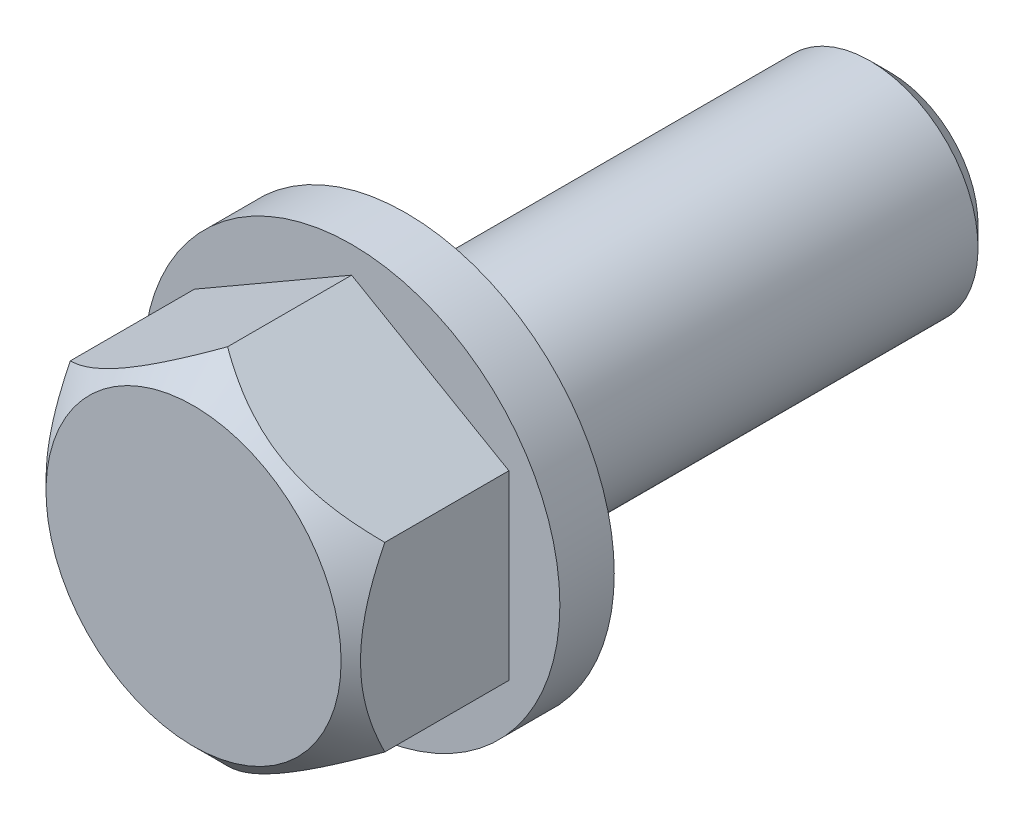
ISO-10303-21;
HEADER;
FILE_DESCRIPTION(('STEP AP214'),'2;1');
FILE_NAME('part.step','',(''),(''),'','','');
FILE_SCHEMA(('AUTOMOTIVE_DESIGN { 1 0 10303 214 1 1 1 1 }'));
ENDSEC;
DATA;
#1=APPLICATION_CONTEXT('core data for automotive mechanical design processes');
#2=APPLICATION_PROTOCOL_DEFINITION('international standard','automotive_design',2000,#1);
#3=PRODUCT_CONTEXT('',#1,'mechanical');
#4=PRODUCT('Part','Part','',(#3));
#5=PRODUCT_RELATED_PRODUCT_CATEGORY('part','',(#4));
#6=PRODUCT_DEFINITION_FORMATION('','',#4);
#7=PRODUCT_DEFINITION_CONTEXT('part definition',#1,'design');
#8=PRODUCT_DEFINITION('design','',#6,#7);
#9=PRODUCT_DEFINITION_SHAPE('','',#8);
#10=(LENGTH_UNIT() NAMED_UNIT(*) SI_UNIT(.MILLI.,.METRE.));
#11=(NAMED_UNIT(*) PLANE_ANGLE_UNIT() SI_UNIT($,.RADIAN.));
#12=(NAMED_UNIT(*) SI_UNIT($,.STERADIAN.) SOLID_ANGLE_UNIT());
#13=UNCERTAINTY_MEASURE_WITH_UNIT(LENGTH_MEASURE(1.E-05),#10,'distance_accuracy_value','');
#14=(GEOMETRIC_REPRESENTATION_CONTEXT(3) GLOBAL_UNCERTAINTY_ASSIGNED_CONTEXT((#13)) GLOBAL_UNIT_ASSIGNED_CONTEXT((#10,
#11,#12)) REPRESENTATION_CONTEXT('',''));
#15=CARTESIAN_POINT('',(0.,0.,0.));
#16=DIRECTION('',(0.,0.,1.));
#17=DIRECTION('',(1.,0.,0.));
#18=AXIS2_PLACEMENT_3D('',#15,#16,#17);
#19=CARTESIAN_POINT('',(0.,-10.6809799800081,-9.3));
#20=DIRECTION('',(0.5,-0.866025403784439,0.));
#21=DIRECTION('',(0.866025403784439,0.5,0.));
#22=AXIS2_PLACEMENT_3D('',#19,#20,#21);
#23=PLANE('',#22);
#24=DIRECTION('',(0.,0.,1.));
#25=VECTOR('',#24,1.);
#26=CARTESIAN_POINT('',(9.25,-5.34048999000404,-9.3));
#27=LINE('',#26,#25);
#28=CARTESIAN_POINT('',(9.25,-5.34048999000404,-9.3));
#29=VERTEX_POINT('',#28);
#30=CARTESIAN_POINT('',(9.25,-5.34048999000404,-2.));
#31=VERTEX_POINT('',#30);
#32=EDGE_CURVE('E125',#29,#31,#27,.T.);
#33=ORIENTED_EDGE('',*,*,#32,.T.);
#34=CARTESIAN_POINT('',(9.2502,-5.3403745199502,-2.00011547192631));
#35=CARTESIAN_POINT('',(9.09117082529351,-5.432190056776,-1.90831281123347));
#36=CARTESIAN_POINT('',(8.93089619346711,-5.52472465860524,-1.81931145467502));
#37=CARTESIAN_POINT('',(8.6076621476001,-5.71134392199781,-1.64780119366554));
#38=CARTESIAN_POINT('',(8.44470132522216,-5.80542939666508,-1.56529583497294));
#39=CARTESIAN_POINT('',(8.1151323907501,-5.99570610969906,-1.40731799648944));
#40=CARTESIAN_POINT('',(7.94850873763559,-6.09190632067808,-1.33188849049753));
#41=CARTESIAN_POINT('',(7.61252468736863,-6.28588680254313,-1.18970062540129));
#42=CARTESIAN_POINT('',(7.44316471309404,-6.38366682928051,-1.12294094058453));
#43=CARTESIAN_POINT('',(7.10443107680896,-6.57923478537328,-1.00020501694454));
#44=CARTESIAN_POINT('',(6.93509904174261,-6.67699868140127,-0.944076478347854));
#45=CARTESIAN_POINT('',(6.59406122655675,-6.87389695580267,-0.842460895203026));
#46=CARTESIAN_POINT('',(6.42235570410425,-6.97303118541196,-0.79697270499414));
#47=CARTESIAN_POINT('',(6.07730535270669,-7.17224609867532,-0.71778303641852));
#48=CARTESIAN_POINT('',(5.90396513173763,-7.27232412191319,-0.684055027186603));
#49=CARTESIAN_POINT('',(5.55582943891564,-7.47332035787849,-0.629126852516565));
#50=CARTESIAN_POINT('',(5.3810341884856,-7.57423844276734,-0.607924815013476));
#51=CARTESIAN_POINT('',(4.95507380895619,-7.82016678255276,-0.572375032527324));
#52=CARTESIAN_POINT('',(4.70344827751648,-7.96544285086446,-0.564914882215165));
#53=CARTESIAN_POINT('',(4.20065228771178,-8.25573225092567,-0.577436236604018));
#54=CARTESIAN_POINT('',(3.94948201975904,-8.40074547274061,-0.597427360386295));
#55=CARTESIAN_POINT('',(3.44950913561555,-8.68940495198837,-0.663671275135095));
#56=CARTESIAN_POINT('',(3.20070948383191,-8.83304949791994,-0.70995343234196));
#57=CARTESIAN_POINT('',(2.7073865670808,-9.1178696167036,-0.8262636629672));
#58=CARTESIAN_POINT('',(2.46286297569687,-9.25904537801233,-0.896289915467007));
#59=CARTESIAN_POINT('',(2.02879977798028,-9.50965188205931,-1.04035187084842));
#60=CARTESIAN_POINT('',(1.83829883414503,-9.61963765326347,-1.11059807056833));
#61=CARTESIAN_POINT('',(1.46071648912269,-9.83763492180337,-1.26240987315371));
#62=CARTESIAN_POINT('',(1.27363519162817,-9.94564635927218,-1.34397581862107));
#63=CARTESIAN_POINT('',(0.903481391738886,-10.1593547552798,-1.5165988394071));
#64=CARTESIAN_POINT('',(0.720398362181627,-10.2650577916788,-1.60762606622998));
#65=CARTESIAN_POINT('',(0.35762230569886,-10.4745066455446,-1.79797669578419));
#66=CARTESIAN_POINT('',(0.177927281929603,-10.5782536158898,-1.89729501176252));
#67=CARTESIAN_POINT('',(-0.000199999999996942,-10.6810954500619,-2.00011547192631));
#68=B_SPLINE_CURVE_WITH_KNOTS('',3,(#34,#35,#36,#37,#38,#39,#40,#41,#42,#43,#44,#45,#46,#47,#48,
#49,#50,#51,#52,#53,#54,#55,#56,#57,#58,#59,#60,#61,#62,#63,#64,#65,#66,#67),.UNSPECIFIED.,.F.,
.F.,(4,2,2,2,2,2,2,2,2,2,2,2,2,2,2,2,4),(0.,0.615926148952827,1.23218619568639,1.85197482577676,
2.47166857139587,3.08167196465217,3.69160964775171,4.3001622758662,4.90862392992529,
5.77920863985932,6.65009848544269,7.52196300514644,8.39376067726822,9.08618244548536,
9.77862517501767,10.468946126611,11.1588466217033),.UNSPECIFIED.);
#69=CARTESIAN_POINT('',(0.,-10.6809799800081,-2.));
#70=VERTEX_POINT('',#69);
#71=EDGE_CURVE('E64',#31,#70,#68,.T.);
#72=ORIENTED_EDGE('',*,*,#71,.T.);
#73=DIRECTION('',(0.,0.,1.));
#74=VECTOR('',#73,1.);
#75=CARTESIAN_POINT('',(0.,-10.6809799800081,-9.3));
#76=LINE('',#75,#74);
#77=CARTESIAN_POINT('',(0.,-10.6809799800081,-9.3));
#78=VERTEX_POINT('',#77);
#79=EDGE_CURVE('E136',#78,#70,#76,.T.);
#80=ORIENTED_EDGE('',*,*,#79,.F.);
#81=DIRECTION('',(0.866025403784439,0.5,0.));
#82=VECTOR('',#81,1.);
#83=CARTESIAN_POINT('',(0.,-10.6809799800081,-9.3));
#84=LINE('',#83,#82);
#85=EDGE_CURVE('E241',#78,#29,#84,.T.);
#86=ORIENTED_EDGE('',*,*,#85,.T.);
#87=EDGE_LOOP('',(#33,#72,#80,#86));
#88=FACE_BOUND('',#87,.T.);
#89=ADVANCED_FACE('F47',(#88),#23,.T.);
#90=CARTESIAN_POINT('',(-9.25,-5.34048999000404,-9.3));
#91=DIRECTION('',(-0.5,-0.866025403784439,0.));
#92=DIRECTION('',(0.866025403784439,-0.5,0.));
#93=AXIS2_PLACEMENT_3D('',#90,#91,#92);
#94=PLANE('',#93);
#95=ORIENTED_EDGE('',*,*,#79,.T.);
#96=CARTESIAN_POINT('',(0.000200000000002945,-10.6810954500619,-2.0001154719263));
#97=CARTESIAN_POINT('',(-0.158829174706487,-10.5892799132361,-1.90831281123347));
#98=CARTESIAN_POINT('',(-0.319103806532885,-10.4967453114069,-1.81931145467501));
#99=CARTESIAN_POINT('',(-0.642337852399898,-10.3101260480143,-1.64780119366554));
#100=CARTESIAN_POINT('',(-0.805298674777844,-10.216040573347,-1.56529583497294));
#101=CARTESIAN_POINT('',(-1.1348676092499,-10.0257638603131,-1.40731799648944));
#102=CARTESIAN_POINT('',(-1.30149126236441,-9.92956364933404,-1.33188849049752));
#103=CARTESIAN_POINT('',(-1.63747531263137,-9.73558316746899,-1.18970062540129));
#104=CARTESIAN_POINT('',(-1.80683528690596,-9.6378031407316,-1.12294094058453));
#105=CARTESIAN_POINT('',(-2.14556892319104,-9.44223518463883,-1.00020501694454));
#106=CARTESIAN_POINT('',(-2.31490095825739,-9.34447128861085,-0.944076478347851));
#107=CARTESIAN_POINT('',(-2.65593877344325,-9.14757301420945,-0.842460895203023));
#108=CARTESIAN_POINT('',(-2.82764429589575,-9.04843878460015,-0.796972704994138));
#109=CARTESIAN_POINT('',(-3.17269464729331,-8.8492238713368,-0.717783036418518));
#110=CARTESIAN_POINT('',(-3.34603486826237,-8.74914584809892,-0.684055027186601));
#111=CARTESIAN_POINT('',(-3.69417056108436,-8.54814961213363,-0.629126852516562));
#112=CARTESIAN_POINT('',(-3.8689658115144,-8.44723152724477,-0.607924815013472));
#113=CARTESIAN_POINT('',(-4.29492619104381,-8.20130318745936,-0.57237503252732));
#114=CARTESIAN_POINT('',(-4.54655172248352,-8.05602711914766,-0.564914882215162));
#115=CARTESIAN_POINT('',(-5.04934771228823,-7.76573771908645,-0.577436236604014));
#116=CARTESIAN_POINT('',(-5.30051798024096,-7.62072449727151,-0.59742736038629));
#117=CARTESIAN_POINT('',(-5.80049086438445,-7.33206501802375,-0.66367127513509));
#118=CARTESIAN_POINT('',(-6.04929051616809,-7.18842047209218,-0.709953432341956));
#119=CARTESIAN_POINT('',(-6.5426134329192,-6.90360035330851,-0.826263662967196));
#120=CARTESIAN_POINT('',(-6.78713702430313,-6.76242459199979,-0.896289915467003));
#121=CARTESIAN_POINT('',(-7.22120022201972,-6.5118180879528,-1.04035187084842));
#122=CARTESIAN_POINT('',(-7.41170116585497,-6.40183231674864,-1.11059807056833));
#123=CARTESIAN_POINT('',(-7.78928351087731,-6.18383504820874,-1.26240987315371));
#124=CARTESIAN_POINT('',(-7.97636480837183,-6.07582361073994,-1.34397581862107));
#125=CARTESIAN_POINT('',(-8.34651860826111,-5.8621152147323,-1.51659883940709));
#126=CARTESIAN_POINT('',(-8.52960163781837,-5.75641217833336,-1.60762606622997));
#127=CARTESIAN_POINT('',(-8.89237769430114,-5.54696332446749,-1.79797669578418));
#128=CARTESIAN_POINT('',(-9.0720727180704,-5.44321635412227,-1.89729501176251));
#129=CARTESIAN_POINT('',(-9.2502,-5.3403745199502,-2.0001154719263));
#130=B_SPLINE_CURVE_WITH_KNOTS('',3,(#96,#97,#98,#99,#100,#101,#102,#103,#104,#105,#106,#107,
#108,#109,#110,#111,#112,#113,#114,#115,#116,#117,#118,#119,#120,#121,#122,#123,#124,#125,#126,
#127,#128,#129),.UNSPECIFIED.,.F.,.F.,(4,2,2,2,2,2,2,2,2,2,2,2,2,2,2,2,4),(0.,0.615926148952828,
1.23218619568639,1.85197482577676,2.47166857139587,3.08167196465217,3.69160964775171,
4.3001622758662,4.90862392992529,5.77920863985932,6.6500984854427,7.52196300514645,
8.39376067726822,9.08618244548536,9.77862517501767,10.468946126611,11.1588466217033),.UNSPECIFIED.);
#131=CARTESIAN_POINT('',(-9.25,-5.34048999000405,-2.));
#132=VERTEX_POINT('',#131);
#133=EDGE_CURVE('E167',#70,#132,#130,.T.);
#134=ORIENTED_EDGE('',*,*,#133,.T.);
#135=DIRECTION('',(0.,0.,1.));
#136=VECTOR('',#135,1.);
#137=CARTESIAN_POINT('',(-9.25,-5.34048999000404,-9.3));
#138=LINE('',#137,#136);
#139=CARTESIAN_POINT('',(-9.25,-5.34048999000404,-9.3));
#140=VERTEX_POINT('',#139);
#141=EDGE_CURVE('E141',#140,#132,#138,.T.);
#142=ORIENTED_EDGE('',*,*,#141,.F.);
#143=DIRECTION('',(0.866025403784439,-0.5,0.));
#144=VECTOR('',#143,1.);
#145=CARTESIAN_POINT('',(-9.25,-5.34048999000404,-9.3));
#146=LINE('',#145,#144);
#147=EDGE_CURVE('E131',#140,#78,#146,.T.);
#148=ORIENTED_EDGE('',*,*,#147,.T.);
#149=EDGE_LOOP('',(#95,#134,#142,#148));
#150=FACE_BOUND('',#149,.T.);
#151=ADVANCED_FACE('F221',(#150),#94,.T.);
#152=CARTESIAN_POINT('',(-9.25,5.34048999000404,-9.3));
#153=DIRECTION('',(-1.,0.,0.));
#154=DIRECTION('',(0.,-1.,0.));
#155=AXIS2_PLACEMENT_3D('',#152,#153,#154);
#156=PLANE('',#155);
#157=ORIENTED_EDGE('',*,*,#141,.T.);
#158=CARTESIAN_POINT('',(-9.25,-16.2073055318061,-9.98018966718476));
#159=CARTESIAN_POINT('',(-9.25,-15.9678781635089,-9.7722539072238));
#160=CARTESIAN_POINT('',(-9.25,-15.7278971183755,-9.56495385584864));
#161=CARTESIAN_POINT('',(-9.25,-15.2466782313579,-9.1518100819196));
#162=CARTESIAN_POINT('',(-9.25,-15.0054403690818,-8.94596638312357));
#163=CARTESIAN_POINT('',(-9.25,-14.5214529988361,-8.53583108855453));
#164=CARTESIAN_POINT('',(-9.25,-14.2787028364467,-8.33154026398782));
#165=CARTESIAN_POINT('',(-9.25,-13.7916274961275,-7.92484960134089));
#166=CARTESIAN_POINT('',(-9.25,-13.5473023236523,-7.72244975671777));
#167=CARTESIAN_POINT('',(-9.25,-12.8005838203051,-7.10936720830747));
#168=CARTESIAN_POINT('',(-9.25,-12.2953670858196,-6.70209594750844));
#169=CARTESIAN_POINT('',(-9.25,-11.5304149451627,-6.10037219288189));
#170=CARTESIAN_POINT('',(-9.25,-11.2742709885391,-5.90134904113106));
#171=CARTESIAN_POINT('',(-9.25,-10.7592285502089,-5.50690305795693));
#172=CARTESIAN_POINT('',(-9.25,-10.5003301254475,-5.31148015233051));
#173=CARTESIAN_POINT('',(-9.25,-9.97902261866834,-4.92463751590594));
#174=CARTESIAN_POINT('',(-9.25,-9.71660934357748,-4.7332234259717));
#175=CARTESIAN_POINT('',(-9.25,-9.1881196213626,-4.35550237519892));
#176=CARTESIAN_POINT('',(-9.25,-8.9220431333944,-4.16919547137397));
#177=CARTESIAN_POINT('',(-9.25,-8.38543327589617,-3.80259161665303));
#178=CARTESIAN_POINT('',(-9.25,-8.11489626573726,-3.62229997923442));
#179=CARTESIAN_POINT('',(-9.25,-7.56894083367665,-3.26925003684118));
#180=CARTESIAN_POINT('',(-9.25,-7.2935225180259,-3.09649156817527));
#181=CARTESIAN_POINT('',(-9.25,-6.73913234468851,-2.76148387056414));
#182=CARTESIAN_POINT('',(-9.25,-6.46020211403959,-2.59916607453986));
#183=CARTESIAN_POINT('',(-9.25,-5.89599970411699,-2.28580012084528));
#184=CARTESIAN_POINT('',(-9.25,-5.61072676547328,-2.13475332210918));
#185=CARTESIAN_POINT('',(-9.25,-5.03354697801002,-1.84691722860305));
#186=CARTESIAN_POINT('',(-9.25,-4.74165053762485,-1.71010722751813));
#187=CARTESIAN_POINT('',(-9.25,-4.15035077340609,-1.4539574466951));
#188=CARTESIAN_POINT('',(-9.25,-3.85095040744964,-1.33461090627094));
#189=CARTESIAN_POINT('',(-9.25,-3.2374254237705,-1.11491653345315));
#190=CARTESIAN_POINT('',(-9.25,-2.92312070330237,-1.01506460459859));
#191=CARTESIAN_POINT('',(-9.25,-2.28704102416632,-0.842647263308085));
#192=CARTESIAN_POINT('',(-9.25,-1.96526726488773,-0.770077501607849));
#193=CARTESIAN_POINT('',(-9.25,-1.31811878474162,-0.657071568600081));
#194=CARTESIAN_POINT('',(-9.25,-0.992779870504323,-0.616434414063451));
#195=CARTESIAN_POINT('',(-9.25,-0.339614584822021,-0.569523971691054));
#196=CARTESIAN_POINT('',(-9.25,-0.011788499089432,-0.563246794878713));
#197=CARTESIAN_POINT('',(-9.25,0.64319116384938,-0.585564944505225));
#198=CARTESIAN_POINT('',(-9.25,0.970342728516819,-0.614218034153677));
#199=CARTESIAN_POINT('',(-9.25,1.62006883717422,-0.70429930220099));
#200=CARTESIAN_POINT('',(-9.25,1.94264244954198,-0.765734056267042));
#201=CARTESIAN_POINT('',(-9.25,2.58315376881698,-0.917852038451622));
#202=CARTESIAN_POINT('',(-9.25,2.90104121716928,-1.00874315281992));
#203=CARTESIAN_POINT('',(-9.25,3.52872539094528,-1.21479914256161));
#204=CARTESIAN_POINT('',(-9.25,3.8385219800585,-1.32996442659717));
#205=CARTESIAN_POINT('',(-9.25,4.51609593501325,-1.60699074321429));
#206=CARTESIAN_POINT('',(-9.25,4.88192980176048,-1.77356435982661));
#207=CARTESIAN_POINT('',(-9.25,5.60272397140078,-2.12895227072771));
#208=CARTESIAN_POINT('',(-9.25,5.9576778820508,-2.31777933540331));
#209=CARTESIAN_POINT('',(-9.25,6.65870649250262,-2.71274056848074));
#210=CARTESIAN_POINT('',(-9.25,7.00476140403261,-2.91890957352869));
#211=CARTESIAN_POINT('',(-9.25,7.68863864749028,-3.34424432957733));
#212=CARTESIAN_POINT('',(-9.25,8.02646258620043,-3.56340751481147));
#213=CARTESIAN_POINT('',(-9.25,8.69706988954527,-4.01308751010601));
#214=CARTESIAN_POINT('',(-9.25,9.02981641353876,-4.24365900128318));
#215=CARTESIAN_POINT('',(-9.25,9.68954518769361,-4.71290111026426));
#216=CARTESIAN_POINT('',(-9.25,10.0165272305575,-4.95157201843363));
#217=CARTESIAN_POINT('',(-9.25,10.6652807103912,-5.43511086247931));
#218=CARTESIAN_POINT('',(-9.25,10.9870576877872,-5.67997138537518));
#219=CARTESIAN_POINT('',(-9.25,11.626542664597,-6.17492887086111));
#220=CARTESIAN_POINT('',(-9.25,11.9442507209077,-6.42502576010033));
#221=CARTESIAN_POINT('',(-9.25,12.5973397567391,-6.94637564824397));
#222=CARTESIAN_POINT('',(-9.25,12.9324832396665,-7.21792570565272));
#223=CARTESIAN_POINT('',(-9.25,13.5994689753692,-7.76504420502935));
#224=CARTESIAN_POINT('',(-9.25,13.9313112275982,-8.04061264766225));
#225=CARTESIAN_POINT('',(-9.25,14.5885335099744,-8.59200844918036));
#226=CARTESIAN_POINT('',(-9.25,14.9139443985055,-8.86779908050375));
#227=CARTESIAN_POINT('',(-9.25,15.5623349577207,-9.42207966751684));
#228=CARTESIAN_POINT('',(-9.25,15.8853151531877,-9.70056900901929));
#229=CARTESIAN_POINT('',(-9.25,16.2073055318061,-9.98018966718477));
#230=B_SPLINE_CURVE_WITH_KNOTS('',3,(#158,#159,#160,#161,#162,#163,#164,#165,#166,#167,#168,
#169,#170,#171,#172,#173,#174,#175,#176,#177,#178,#179,#180,#181,#182,#183,#184,#185,#186,#187,
#188,#189,#190,#191,#192,#193,#194,#195,#196,#197,#198,#199,#200,#201,#202,#203,#204,#205,#206,
#207,#208,#209,#210,#211,#212,#213,#214,#215,#216,#217,#218,#219,#220,#221,#222,#223,#224,#225,
#226,#227,#228,#229),.UNSPECIFIED.,.F.,.F.,(4,2,2,2,2,2,2,2,2,2,2,2,2,2,2,2,2,2,2,2,2,2,2,2,2,2,
2,2,2,2,2,2,2,2,2,4),(0.,0.951349366823518,1.90271421763447,2.85452416399449,3.80633081581425,
5.75295862793108,6.72606325135628,7.69914779604991,8.67352029327958,9.64790366340001,
10.6231260999126,11.5983273348509,12.5662803021357,13.5343497867131,14.5009910101004,
15.4672570188103,16.4555812424731,17.4437478427394,18.4256439818353,19.4074289843617,
20.3908397421021,21.3744478361953,22.3651546246029,23.3558780931577,24.5607737342995,
25.7663642162179,26.9744371437454,28.1822723204906,29.396597885687,30.6109670307448,
31.8239449163693,33.0369058219907,34.3309100547464,35.6249145016516,36.9045756428919,
38.1839520893548),.UNSPECIFIED.);
#231=CARTESIAN_POINT('',(-9.25,5.34048999000404,-2.));
#232=VERTEX_POINT('',#231);
#233=EDGE_CURVE('E164',#132,#232,#230,.T.);
#234=ORIENTED_EDGE('',*,*,#233,.T.);
#235=DIRECTION('',(0.,0.,1.));
#236=VECTOR('',#235,1.);
#237=CARTESIAN_POINT('',(-9.25,5.34048999000404,-9.3));
#238=LINE('',#237,#236);
#239=CARTESIAN_POINT('',(-9.25,5.34048999000404,-9.3));
#240=VERTEX_POINT('',#239);
#241=EDGE_CURVE('E129',#240,#232,#238,.T.);
#242=ORIENTED_EDGE('',*,*,#241,.F.);
#243=DIRECTION('',(0.,-1.,0.));
#244=VECTOR('',#243,1.);
#245=CARTESIAN_POINT('',(-9.25,5.34048999000404,-9.3));
#246=LINE('',#245,#244);
#247=EDGE_CURVE('E163',#240,#140,#246,.T.);
#248=ORIENTED_EDGE('',*,*,#247,.T.);
#249=EDGE_LOOP('',(#157,#234,#242,#248));
#250=FACE_BOUND('',#249,.T.);
#251=ADVANCED_FACE('F162',(#250),#156,.T.);
#252=CARTESIAN_POINT('',(0.,10.6809799800081,-9.3));
#253=DIRECTION('',(-0.5,0.866025403784439,0.));
#254=DIRECTION('',(-0.866025403784439,-0.5,0.));
#255=AXIS2_PLACEMENT_3D('',#252,#253,#254);
#256=PLANE('',#255);
#257=ORIENTED_EDGE('',*,*,#241,.T.);
#258=CARTESIAN_POINT('',(-9.2502,5.3403745199502,-2.0001154719263));
#259=CARTESIAN_POINT('',(-9.09117082529351,5.432190056776,-1.90831281123347));
#260=CARTESIAN_POINT('',(-8.93089619346711,5.52472465860524,-1.81931145467501));
#261=CARTESIAN_POINT('',(-8.6076621476001,5.71134392199781,-1.64780119366554));
#262=CARTESIAN_POINT('',(-8.44470132522215,5.80542939666508,-1.56529583497294));
#263=CARTESIAN_POINT('',(-8.1151323907501,5.99570610969906,-1.40731799648944));
#264=CARTESIAN_POINT('',(-7.94850873763559,6.09190632067808,-1.33188849049752));
#265=CARTESIAN_POINT('',(-7.61252468736863,6.28588680254313,-1.18970062540129));
#266=CARTESIAN_POINT('',(-7.44316471309404,6.38366682928051,-1.12294094058453));
#267=CARTESIAN_POINT('',(-7.10443107680896,6.57923478537328,-1.00020501694454));
#268=CARTESIAN_POINT('',(-6.93509904174261,6.67699868140127,-0.944076478347853));
#269=CARTESIAN_POINT('',(-6.59406122655675,6.87389695580267,-0.842460895203025));
#270=CARTESIAN_POINT('',(-6.42235570410424,6.97303118541196,-0.79697270499414));
#271=CARTESIAN_POINT('',(-6.07730535270669,7.17224609867532,-0.717783036418521));
#272=CARTESIAN_POINT('',(-5.90396513173763,7.27232412191319,-0.684055027186604));
#273=CARTESIAN_POINT('',(-5.55582943891564,7.47332035787849,-0.629126852516564));
#274=CARTESIAN_POINT('',(-5.3810341884856,7.57423844276734,-0.607924815013474));
#275=CARTESIAN_POINT('',(-4.95507380895619,7.82016678255276,-0.572375032527322));
#276=CARTESIAN_POINT('',(-4.70344827751647,7.96544285086446,-0.564914882215164));
#277=CARTESIAN_POINT('',(-4.20065228771177,8.25573225092567,-0.577436236604017));
#278=CARTESIAN_POINT('',(-3.94948201975904,8.40074547274061,-0.597427360386293));
#279=CARTESIAN_POINT('',(-3.44950913561555,8.68940495198837,-0.663671275135094));
#280=CARTESIAN_POINT('',(-3.20070948383191,8.83304949791994,-0.70995343234196));
#281=CARTESIAN_POINT('',(-2.7073865670808,9.1178696167036,-0.8262636629672));
#282=CARTESIAN_POINT('',(-2.46286297569687,9.25904537801233,-0.896289915467007));
#283=CARTESIAN_POINT('',(-2.02879977798028,9.50965188205931,-1.04035187084842));
#284=CARTESIAN_POINT('',(-1.83829883414503,9.61963765326347,-1.11059807056833));
#285=CARTESIAN_POINT('',(-1.46071648912268,9.83763492180337,-1.26240987315371));
#286=CARTESIAN_POINT('',(-1.27363519162816,9.94564635927218,-1.34397581862107));
#287=CARTESIAN_POINT('',(-0.903481391738882,10.1593547552798,-1.5165988394071));
#288=CARTESIAN_POINT('',(-0.720398362181622,10.2650577916788,-1.60762606622998));
#289=CARTESIAN_POINT('',(-0.357622305698855,10.4745066455446,-1.79797669578419));
#290=CARTESIAN_POINT('',(-0.177927281929599,10.5782536158898,-1.89729501176252));
#291=CARTESIAN_POINT('',(0.000200000000001436,10.6810954500619,-2.00011547192631));
#292=B_SPLINE_CURVE_WITH_KNOTS('',3,(#258,#259,#260,#261,#262,#263,#264,#265,#266,#267,#268,
#269,#270,#271,#272,#273,#274,#275,#276,#277,#278,#279,#280,#281,#282,#283,#284,#285,#286,#287,
#288,#289,#290,#291),.UNSPECIFIED.,.F.,.F.,(4,2,2,2,2,2,2,2,2,2,2,2,2,2,2,2,4),(0.,
0.615926148952828,1.23218619568639,1.85197482577676,2.47166857139587,3.08167196465217,
3.69160964775171,4.3001622758662,4.90862392992529,5.77920863985932,6.65009848544269,
7.52196300514644,8.39376067726822,9.08618244548536,9.77862517501767,10.468946126611,
11.1588466217033),.UNSPECIFIED.);
#293=CARTESIAN_POINT('',(0.,10.6809799800081,-2.));
#294=VERTEX_POINT('',#293);
#295=EDGE_CURVE('E120',#232,#294,#292,.T.);
#296=ORIENTED_EDGE('',*,*,#295,.T.);
#297=DIRECTION('',(0.,0.,1.));
#298=VECTOR('',#297,1.);
#299=CARTESIAN_POINT('',(0.,10.6809799800081,-9.3));
#300=LINE('',#299,#298);
#301=CARTESIAN_POINT('',(0.,10.6809799800081,-9.3));
#302=VERTEX_POINT('',#301);
#303=EDGE_CURVE('E118',#302,#294,#300,.T.);
#304=ORIENTED_EDGE('',*,*,#303,.F.);
#305=DIRECTION('',(-0.866025403784439,-0.5,0.));
#306=VECTOR('',#305,1.);
#307=CARTESIAN_POINT('',(0.,10.6809799800081,-9.3));
#308=LINE('',#307,#306);
#309=EDGE_CURVE('E158',#302,#240,#308,.T.);
#310=ORIENTED_EDGE('',*,*,#309,.T.);
#311=EDGE_LOOP('',(#257,#296,#304,#310));
#312=FACE_BOUND('',#311,.T.);
#313=ADVANCED_FACE('F157',(#312),#256,.T.);
#314=CARTESIAN_POINT('',(9.25,5.34048999000404,-9.3));
#315=DIRECTION('',(0.5,0.866025403784439,0.));
#316=DIRECTION('',(-0.866025403784439,0.5,0.));
#317=AXIS2_PLACEMENT_3D('',#314,#315,#316);
#318=PLANE('',#317);
#319=ORIENTED_EDGE('',*,*,#303,.T.);
#320=CARTESIAN_POINT('',(-0.00019999999999838,10.6810954500619,-2.0001154719263));
#321=CARTESIAN_POINT('',(0.15882917470649,10.5892799132361,-1.90831281123347));
#322=CARTESIAN_POINT('',(0.319103806532888,10.4967453114069,-1.81931145467501));
#323=CARTESIAN_POINT('',(0.642337852399901,10.3101260480143,-1.64780119366554));
#324=CARTESIAN_POINT('',(0.805298674777847,10.216040573347,-1.56529583497294));
#325=CARTESIAN_POINT('',(1.1348676092499,10.0257638603131,-1.40731799648944));
#326=CARTESIAN_POINT('',(1.30149126236441,9.92956364933404,-1.33188849049752));
#327=CARTESIAN_POINT('',(1.63747531263137,9.73558316746899,-1.18970062540129));
#328=CARTESIAN_POINT('',(1.80683528690596,9.6378031407316,-1.12294094058453));
#329=CARTESIAN_POINT('',(2.14556892319104,9.44223518463883,-1.00020501694454));
#330=CARTESIAN_POINT('',(2.31490095825739,9.34447128861085,-0.944076478347853));
#331=CARTESIAN_POINT('',(2.65593877344325,9.14757301420945,-0.842460895203025));
#332=CARTESIAN_POINT('',(2.82764429589576,9.04843878460015,-0.796972704994139));
#333=CARTESIAN_POINT('',(3.17269464729331,8.8492238713368,-0.717783036418519));
#334=CARTESIAN_POINT('',(3.34603486826237,8.74914584809893,-0.684055027186602));
#335=CARTESIAN_POINT('',(3.69417056108436,8.54814961213363,-0.629126852516563));
#336=CARTESIAN_POINT('',(3.8689658115144,8.44723152724478,-0.607924815013474));
#337=CARTESIAN_POINT('',(4.29492619104381,8.20130318745936,-0.572375032527323));
#338=CARTESIAN_POINT('',(4.54655172248352,8.05602711914766,-0.564914882215165));
#339=CARTESIAN_POINT('',(5.04934771228823,7.76573771908645,-0.577436236604017));
#340=CARTESIAN_POINT('',(5.30051798024096,7.62072449727151,-0.597427360386294));
#341=CARTESIAN_POINT('',(5.80049086438445,7.33206501802375,-0.663671275135094));
#342=CARTESIAN_POINT('',(6.04929051616809,7.18842047209218,-0.709953432341958));
#343=CARTESIAN_POINT('',(6.5426134329192,6.90360035330852,-0.826263662967198));
#344=CARTESIAN_POINT('',(6.78713702430313,6.76242459199979,-0.896289915467006));
#345=CARTESIAN_POINT('',(7.22120022201972,6.51181808795281,-1.04035187084842));
#346=CARTESIAN_POINT('',(7.41170116585497,6.40183231674865,-1.11059807056833));
#347=CARTESIAN_POINT('',(7.78928351087732,6.18383504820875,-1.26240987315371));
#348=CARTESIAN_POINT('',(7.97636480837184,6.07582361073994,-1.34397581862107));
#349=CARTESIAN_POINT('',(8.34651860826112,5.8621152147323,-1.5165988394071));
#350=CARTESIAN_POINT('',(8.52960163781838,5.75641217833337,-1.60762606622998));
#351=CARTESIAN_POINT('',(8.89237769430114,5.54696332446749,-1.79797669578419));
#352=CARTESIAN_POINT('',(9.0720727180704,5.44321635412227,-1.89729501176252));
#353=CARTESIAN_POINT('',(9.2502,5.3403745199502,-2.00011547192631));
#354=B_SPLINE_CURVE_WITH_KNOTS('',3,(#320,#321,#322,#323,#324,#325,#326,#327,#328,#329,#330,
#331,#332,#333,#334,#335,#336,#337,#338,#339,#340,#341,#342,#343,#344,#345,#346,#347,#348,#349,
#350,#351,#352,#353),.UNSPECIFIED.,.F.,.F.,(4,2,2,2,2,2,2,2,2,2,2,2,2,2,2,2,4),(0.,
0.615926148952826,1.23218619568639,1.85197482577676,2.47166857139587,3.08167196465217,
3.6916096477517,4.3001622758662,4.90862392992529,5.77920863985932,6.65009848544269,
7.52196300514644,8.39376067726822,9.08618244548536,9.77862517501767,10.468946126611,
11.1588466217033),.UNSPECIFIED.);
#355=CARTESIAN_POINT('',(9.25,5.34048999000404,-2.));
#356=VERTEX_POINT('',#355);
#357=EDGE_CURVE('E103',#294,#356,#354,.T.);
#358=ORIENTED_EDGE('',*,*,#357,.T.);
#359=DIRECTION('',(0.,0.,1.));
#360=VECTOR('',#359,1.);
#361=CARTESIAN_POINT('',(9.25,5.34048999000404,-9.3));
#362=LINE('',#361,#360);
#363=CARTESIAN_POINT('',(9.25,5.34048999000404,-9.3));
#364=VERTEX_POINT('',#363);
#365=EDGE_CURVE('E115',#364,#356,#362,.T.);
#366=ORIENTED_EDGE('',*,*,#365,.F.);
#367=DIRECTION('',(-0.866025403784439,0.5,0.));
#368=VECTOR('',#367,1.);
#369=CARTESIAN_POINT('',(9.25,5.34048999000404,-9.3));
#370=LINE('',#369,#368);
#371=EDGE_CURVE('E72',#364,#302,#370,.T.);
#372=ORIENTED_EDGE('',*,*,#371,.T.);
#373=EDGE_LOOP('',(#319,#358,#366,#372));
#374=FACE_BOUND('',#373,.T.);
#375=ADVANCED_FACE('F114',(#374),#318,.T.);
#376=CARTESIAN_POINT('',(9.25,-5.34048999000404,-9.3));
#377=DIRECTION('',(1.,0.,0.));
#378=DIRECTION('',(0.,0.,-1.));
#379=AXIS2_PLACEMENT_3D('',#376,#377,#378);
#380=PLANE('',#379);
#381=ORIENTED_EDGE('',*,*,#365,.T.);
#382=CARTESIAN_POINT('',(9.25,16.2073055318061,-9.98018966718477));
#383=CARTESIAN_POINT('',(9.25,15.9678781635089,-9.7722539072238));
#384=CARTESIAN_POINT('',(9.25,15.7278971183755,-9.56495385584864));
#385=CARTESIAN_POINT('',(9.25,15.2466782313579,-9.1518100819196));
#386=CARTESIAN_POINT('',(9.25,15.0054403690818,-8.94596638312357));
#387=CARTESIAN_POINT('',(9.25,14.5214529988361,-8.53583108855453));
#388=CARTESIAN_POINT('',(9.25,14.2787028364467,-8.33154026398782));
#389=CARTESIAN_POINT('',(9.25,13.7916274961275,-7.9248496013409));
#390=CARTESIAN_POINT('',(9.25,13.5473023236523,-7.72244975671778));
#391=CARTESIAN_POINT('',(9.25,12.8005838203051,-7.10936720830748));
#392=CARTESIAN_POINT('',(9.25,12.2953670858197,-6.70209594750845));
#393=CARTESIAN_POINT('',(9.25,11.5304149451627,-6.10037219288189));
#394=CARTESIAN_POINT('',(9.25,11.2742709885391,-5.90134904113106));
#395=CARTESIAN_POINT('',(9.25,10.7592285502089,-5.50690305795694));
#396=CARTESIAN_POINT('',(9.25,10.5003301254475,-5.31148015233052));
#397=CARTESIAN_POINT('',(9.25,9.97902261866834,-4.92463751590594));
#398=CARTESIAN_POINT('',(9.25,9.71660934357748,-4.73322342597171));
#399=CARTESIAN_POINT('',(9.25,9.1881196213626,-4.35550237519893));
#400=CARTESIAN_POINT('',(9.25,8.92204313339441,-4.16919547137397));
#401=CARTESIAN_POINT('',(9.25,8.38543327589617,-3.80259161665304));
#402=CARTESIAN_POINT('',(9.25,8.11489626573726,-3.62229997923443));
#403=CARTESIAN_POINT('',(9.25,7.56894083367665,-3.26925003684118));
#404=CARTESIAN_POINT('',(9.25,7.29352251802591,-3.09649156817527));
#405=CARTESIAN_POINT('',(9.25,6.73913234468851,-2.76148387056415));
#406=CARTESIAN_POINT('',(9.25,6.4602021140396,-2.59916607453986));
#407=CARTESIAN_POINT('',(9.25,5.895999704117,-2.28580012084528));
#408=CARTESIAN_POINT('',(9.25,5.61072676547329,-2.13475332210918));
#409=CARTESIAN_POINT('',(9.25,5.03354697801002,-1.84691722860306));
#410=CARTESIAN_POINT('',(9.25,4.74165053762485,-1.71010722751814));
#411=CARTESIAN_POINT('',(9.25,4.15035077340609,-1.45395744669511));
#412=CARTESIAN_POINT('',(9.25,3.85095040744965,-1.33461090627094));
#413=CARTESIAN_POINT('',(9.25,3.2374254237705,-1.11491653345316));
#414=CARTESIAN_POINT('',(9.25,2.92312070330237,-1.0150646045986));
#415=CARTESIAN_POINT('',(9.25,2.28704102416633,-0.842647263308088));
#416=CARTESIAN_POINT('',(9.25,1.96526726488773,-0.770077501607852));
#417=CARTESIAN_POINT('',(9.25,1.31811878474162,-0.657071568600083));
#418=CARTESIAN_POINT('',(9.25,0.992779870504324,-0.616434414063453));
#419=CARTESIAN_POINT('',(9.25,0.339614584822022,-0.569523971691057));
#420=CARTESIAN_POINT('',(9.25,0.0117884990894331,-0.563246794878717));
#421=CARTESIAN_POINT('',(9.25,-0.643191163849379,-0.58556494450523));
#422=CARTESIAN_POINT('',(9.25,-0.970342728516819,-0.614218034153681));
#423=CARTESIAN_POINT('',(9.25,-1.62006883717422,-0.704299302200994));
#424=CARTESIAN_POINT('',(9.25,-1.94264244954198,-0.765734056267045));
#425=CARTESIAN_POINT('',(9.25,-2.58315376881698,-0.917852038451624));
#426=CARTESIAN_POINT('',(9.25,-2.90104121716928,-1.00874315281992));
#427=CARTESIAN_POINT('',(9.25,-3.52872539094528,-1.21479914256161));
#428=CARTESIAN_POINT('',(9.25,-3.8385219800585,-1.32996442659718));
#429=CARTESIAN_POINT('',(9.25,-4.51609593501325,-1.60699074321429));
#430=CARTESIAN_POINT('',(9.25,-4.88192980176048,-1.77356435982661));
#431=CARTESIAN_POINT('',(9.25,-5.60272397140078,-2.12895227072771));
#432=CARTESIAN_POINT('',(9.25,-5.95767788205081,-2.31777933540331));
#433=CARTESIAN_POINT('',(9.25,-6.65870649250262,-2.71274056848075));
#434=CARTESIAN_POINT('',(9.25,-7.00476140403261,-2.91890957352869));
#435=CARTESIAN_POINT('',(9.25,-7.68863864749028,-3.34424432957733));
#436=CARTESIAN_POINT('',(9.25,-8.02646258620043,-3.56340751481147));
#437=CARTESIAN_POINT('',(9.25,-8.69706988954527,-4.01308751010601));
#438=CARTESIAN_POINT('',(9.25,-9.02981641353876,-4.24365900128318));
#439=CARTESIAN_POINT('',(9.25,-9.68954518769361,-4.71290111026426));
#440=CARTESIAN_POINT('',(9.25,-10.0165272305575,-4.95157201843363));
#441=CARTESIAN_POINT('',(9.25,-10.6652807103912,-5.43511086247931));
#442=CARTESIAN_POINT('',(9.25,-10.9870576877872,-5.67997138537518));
#443=CARTESIAN_POINT('',(9.25,-11.626542664597,-6.17492887086111));
#444=CARTESIAN_POINT('',(9.25,-11.9442507209077,-6.42502576010033));
#445=CARTESIAN_POINT('',(9.25,-12.5973397567391,-6.94637564824397));
#446=CARTESIAN_POINT('',(9.25,-12.9324832396665,-7.21792570565271));
#447=CARTESIAN_POINT('',(9.25,-13.5994689753692,-7.76504420502935));
#448=CARTESIAN_POINT('',(9.25,-13.9313112275982,-8.04061264766225));
#449=CARTESIAN_POINT('',(9.25,-14.5885335099743,-8.59200844918036));
#450=CARTESIAN_POINT('',(9.25,-14.9139443985055,-8.86779908050375));
#451=CARTESIAN_POINT('',(9.25,-15.5623349577207,-9.42207966751684));
#452=CARTESIAN_POINT('',(9.25,-15.8853151531877,-9.70056900901929));
#453=CARTESIAN_POINT('',(9.25,-16.2073055318061,-9.98018966718477));
#454=B_SPLINE_CURVE_WITH_KNOTS('',3,(#382,#383,#384,#385,#386,#387,#388,#389,#390,#391,#392,
#393,#394,#395,#396,#397,#398,#399,#400,#401,#402,#403,#404,#405,#406,#407,#408,#409,#410,#411,
#412,#413,#414,#415,#416,#417,#418,#419,#420,#421,#422,#423,#424,#425,#426,#427,#428,#429,#430,
#431,#432,#433,#434,#435,#436,#437,#438,#439,#440,#441,#442,#443,#444,#445,#446,#447,#448,#449,
#450,#451,#452,#453),.UNSPECIFIED.,.F.,.F.,(4,2,2,2,2,2,2,2,2,2,2,2,2,2,2,2,2,2,2,2,2,2,2,2,2,2,
2,2,2,2,2,2,2,2,2,4),(0.,0.951349366823519,1.90271421763447,2.85452416399449,3.80633081581425,
5.75295862793108,6.72606325135628,7.69914779604991,8.67352029327958,9.64790366340001,
10.6231260999126,11.5983273348509,12.5662803021357,13.5343497867131,14.5009910101004,
15.4672570188103,16.4555812424731,17.4437478427394,18.4256439818353,19.4074289843617,
20.3908397421021,21.3744478361953,22.365154624603,23.3558780931577,24.5607737342995,
25.7663642162179,26.9744371437454,28.1822723204906,29.396597885687,30.6109670307448,
31.8239449163693,33.0369058219907,34.3309100547464,35.6249145016516,36.904575642892,
38.1839520893549),.UNSPECIFIED.);
#455=EDGE_CURVE('E99',#356,#31,#454,.T.);
#456=ORIENTED_EDGE('',*,*,#455,.T.);
#457=ORIENTED_EDGE('',*,*,#32,.F.);
#458=DIRECTION('',(0.,1.,0.));
#459=VECTOR('',#458,1.);
#460=CARTESIAN_POINT('',(9.25,-5.34048999000404,-9.3));
#461=LINE('',#460,#459);
#462=EDGE_CURVE('E123',#29,#364,#461,.T.);
#463=ORIENTED_EDGE('',*,*,#462,.T.);
#464=EDGE_LOOP('',(#381,#456,#457,#463));
#465=FACE_BOUND('',#464,.T.);
#466=ADVANCED_FACE('F122',(#465),#380,.T.);
#467=CARTESIAN_POINT('',(0.,0.,-9.3));
#468=DIRECTION('',(0.,0.,1.));
#469=DIRECTION('',(0.,-1.,0.));
#470=AXIS2_PLACEMENT_3D('',#467,#468,#469);
#471=PLANE('',#470);
#472=CARTESIAN_POINT('',(0.,0.,-9.3));
#473=DIRECTION('',(0.,0.,-1.));
#474=DIRECTION('',(0.,1.,0.));
#475=AXIS2_PLACEMENT_3D('',#472,#473,#474);
#476=CIRCLE('',#475,12.25);
#477=CARTESIAN_POINT('',(0.,12.25,-9.3));
#478=VERTEX_POINT('',#477);
#479=EDGE_CURVE('E237',#478,#478,#476,.T.);
#480=ORIENTED_EDGE('',*,*,#479,.F.);
#481=EDGE_LOOP('',(#480));
#482=FACE_BOUND('',#481,.T.);
#483=ORIENTED_EDGE('',*,*,#85,.F.);
#484=ORIENTED_EDGE('',*,*,#147,.F.);
#485=ORIENTED_EDGE('',*,*,#247,.F.);
#486=ORIENTED_EDGE('',*,*,#309,.F.);
#487=ORIENTED_EDGE('',*,*,#371,.F.);
#488=ORIENTED_EDGE('',*,*,#462,.F.);
#489=EDGE_LOOP('',(#483,#484,#485,#486,#487,#488));
#490=FACE_BOUND('',#489,.T.);
#491=ADVANCED_FACE('F218',(#482,#490),#471,.T.);
#492=CARTESIAN_POINT('',(0.,0.,-41.));
#493=DIRECTION('',(0.,0.,-1.));
#494=DIRECTION('',(0.,1.,0.));
#495=AXIS2_PLACEMENT_3D('',#492,#493,#494);
#496=CYLINDRICAL_SURFACE('',#495,12.25);
#497=ORIENTED_EDGE('',*,*,#479,.T.);
#498=EDGE_LOOP('',(#497));
#499=FACE_BOUND('',#498,.T.);
#500=CARTESIAN_POINT('',(0.,0.,-12.5));
#501=DIRECTION('',(0.,0.,-1.));
#502=DIRECTION('',(0.,1.,0.));
#503=AXIS2_PLACEMENT_3D('',#500,#501,#502);
#504=CIRCLE('',#503,12.25);
#505=CARTESIAN_POINT('',(0.,12.25,-12.5));
#506=VERTEX_POINT('',#505);
#507=EDGE_CURVE('E233',#506,#506,#504,.T.);
#508=ORIENTED_EDGE('',*,*,#507,.F.);
#509=EDGE_LOOP('',(#508));
#510=FACE_BOUND('',#509,.T.);
#511=ADVANCED_FACE('F253',(#499,#510),#496,.T.);
#512=CARTESIAN_POINT('',(0.,12.25,-12.5));
#513=DIRECTION('',(0.,0.,-1.));
#514=DIRECTION('',(0.,1.,0.));
#515=AXIS2_PLACEMENT_3D('',#512,#513,#514);
#516=PLANE('',#515);
#517=ORIENTED_EDGE('',*,*,#507,.T.);
#518=EDGE_LOOP('',(#517));
#519=FACE_BOUND('',#518,.T.);
#520=CARTESIAN_POINT('',(0.,0.,-12.5));
#521=DIRECTION('',(0.,0.,-1.));
#522=DIRECTION('',(0.,1.,0.));
#523=AXIS2_PLACEMENT_3D('',#520,#521,#522);
#524=CIRCLE('',#523,6.35);
#525=CARTESIAN_POINT('',(0.,6.35,-12.5));
#526=VERTEX_POINT('',#525);
#527=EDGE_CURVE('E229',#526,#526,#524,.T.);
#528=ORIENTED_EDGE('',*,*,#527,.F.);
#529=EDGE_LOOP('',(#528));
#530=FACE_BOUND('',#529,.T.);
#531=ADVANCED_FACE('F259',(#519,#530),#516,.T.);
#532=CARTESIAN_POINT('',(0.,0.,-41.));
#533=DIRECTION('',(0.,0.,-1.));
#534=DIRECTION('',(0.,1.,0.));
#535=AXIS2_PLACEMENT_3D('',#532,#533,#534);
#536=CYLINDRICAL_SURFACE('',#535,6.35);
#537=CARTESIAN_POINT('',(0.,0.,-39.8));
#538=DIRECTION('',(0.,0.,-1.));
#539=DIRECTION('',(0.,1.,0.));
#540=AXIS2_PLACEMENT_3D('',#537,#538,#539);
#541=CIRCLE('',#540,6.35);
#542=CARTESIAN_POINT('',(0.,6.35,-39.8));
#543=VERTEX_POINT('',#542);
#544=EDGE_CURVE('E11',#543,#543,#541,.F.);
#545=ORIENTED_EDGE('',*,*,#544,.T.);
#546=EDGE_LOOP('',(#545));
#547=FACE_BOUND('',#546,.T.);
#548=ORIENTED_EDGE('',*,*,#527,.T.);
#549=EDGE_LOOP('',(#548));
#550=FACE_BOUND('',#549,.T.);
#551=ADVANCED_FACE('F300',(#547,#550),#536,.T.);
#552=CARTESIAN_POINT('',(0.,6.35,-41.));
#553=DIRECTION('',(0.,0.,-1.));
#554=DIRECTION('',(0.,1.,0.));
#555=AXIS2_PLACEMENT_3D('',#552,#553,#554);
#556=PLANE('',#555);
#557=CARTESIAN_POINT('',(0.,0.,-41.));
#558=DIRECTION('',(0.,0.,-1.));
#559=DIRECTION('',(0.,1.,0.));
#560=AXIS2_PLACEMENT_3D('',#557,#558,#559);
#561=CIRCLE('',#560,5.15);
#562=CARTESIAN_POINT('',(0.,5.15,-41.));
#563=VERTEX_POINT('',#562);
#564=EDGE_CURVE('E57',#563,#563,#561,.T.);
#565=ORIENTED_EDGE('',*,*,#564,.T.);
#566=EDGE_LOOP('',(#565));
#567=FACE_BOUND('',#566,.T.);
#568=ADVANCED_FACE('F195',(#567),#556,.T.);
#569=CARTESIAN_POINT('',(0.,0.,0.));
#570=DIRECTION('',(0.,0.,-1.));
#571=DIRECTION('',(-1.,0.,0.));
#572=AXIS2_PLACEMENT_3D('',#569,#570,#571);
#573=CONICAL_SURFACE('',#572,8.68097998000808,0.785398163397448);
#574=ORIENTED_EDGE('',*,*,#455,.F.);
#575=ORIENTED_EDGE('',*,*,#357,.F.);
#576=ORIENTED_EDGE('',*,*,#295,.F.);
#577=ORIENTED_EDGE('',*,*,#233,.F.);
#578=ORIENTED_EDGE('',*,*,#133,.F.);
#579=ORIENTED_EDGE('',*,*,#71,.F.);
#580=EDGE_LOOP('',(#574,#575,#576,#577,#578,#579));
#581=FACE_BOUND('',#580,.T.);
#582=CARTESIAN_POINT('',(0.,0.,0.));
#583=DIRECTION('',(0.,0.,1.));
#584=DIRECTION('',(1.,0.,0.));
#585=AXIS2_PLACEMENT_3D('',#582,#583,#584);
#586=CIRCLE('',#585,8.68097998000808);
#587=CARTESIAN_POINT('',(8.68097998000808,0.,0.));
#588=VERTEX_POINT('',#587);
#589=EDGE_CURVE('E110',#588,#588,#586,.T.);
#590=ORIENTED_EDGE('',*,*,#589,.F.);
#591=EDGE_LOOP('',(#590));
#592=FACE_BOUND('',#591,.T.);
#593=ADVANCED_FACE('F101',(#581,#592),#573,.T.);
#594=CARTESIAN_POINT('',(0.,0.,0.));
#595=DIRECTION('',(0.,0.,1.));
#596=DIRECTION('',(1.,0.,0.));
#597=AXIS2_PLACEMENT_3D('',#594,#595,#596);
#598=PLANE('',#597);
#599=ORIENTED_EDGE('',*,*,#589,.T.);
#600=EDGE_LOOP('',(#599));
#601=FACE_BOUND('',#600,.T.);
#602=ADVANCED_FACE('F194',(#601),#598,.T.);
#603=CARTESIAN_POINT('',(0.,0.,-41.));
#604=DIRECTION('',(0.,0.,1.));
#605=DIRECTION('',(0.,-1.,0.));
#606=AXIS2_PLACEMENT_3D('',#603,#604,#605);
#607=CONICAL_SURFACE('',#606,5.15,0.785398163397447);
#608=ORIENTED_EDGE('',*,*,#544,.F.);
#609=EDGE_LOOP('',(#608));
#610=FACE_BOUND('',#609,.T.);
#611=ORIENTED_EDGE('',*,*,#564,.F.);
#612=EDGE_LOOP('',(#611));
#613=FACE_BOUND('',#612,.T.);
#614=ADVANCED_FACE('F50',(#610,#613),#607,.T.);
#615=CLOSED_SHELL('',(#89,#151,#251,#313,#375,#466,#491,#511,#531,#551,#568,#593,#602,#614));
#616=MANIFOLD_SOLID_BREP('B2',#615);
#617=ADVANCED_BREP_SHAPE_REPRESENTATION('',(#18,#616),#14);
#618=SHAPE_DEFINITION_REPRESENTATION(#9,#617);
ENDSEC;
END-ISO-10303-21;
